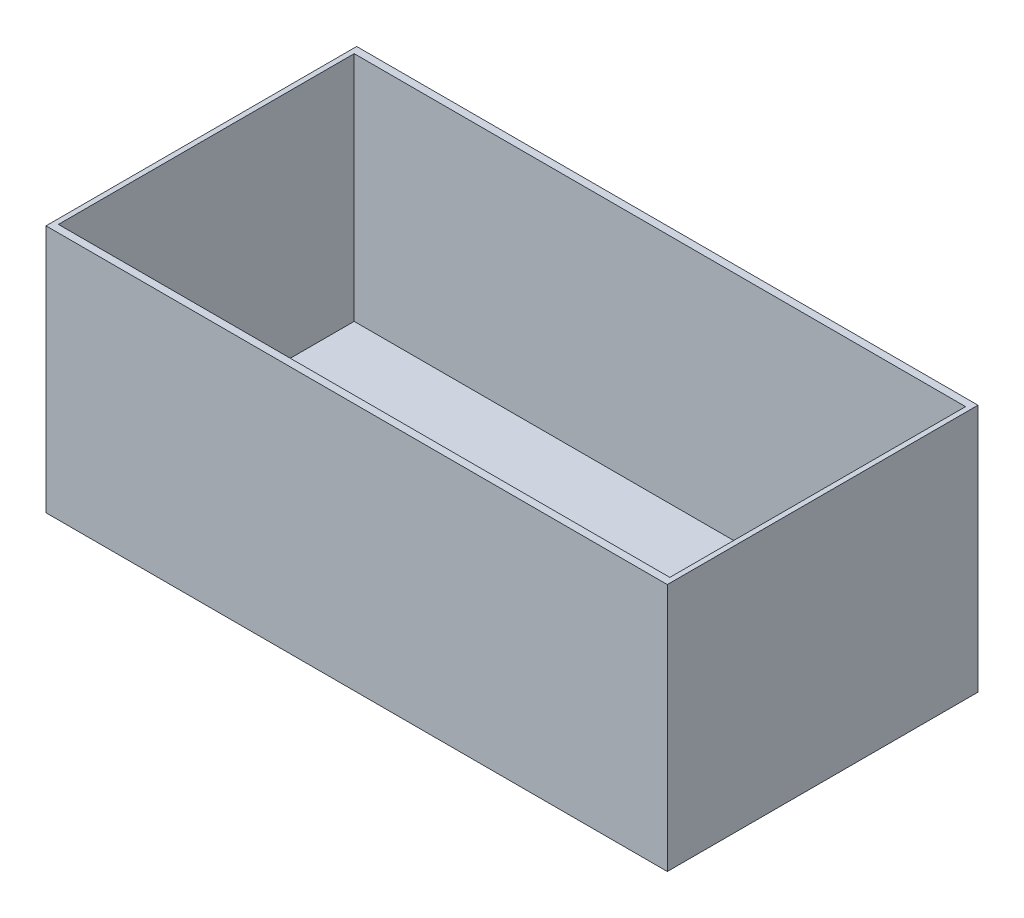
ISO-10303-21;
HEADER;
FILE_DESCRIPTION(('STEP AP214'),'2;1');
FILE_NAME('part.step','',(''),(''),'','','');
FILE_SCHEMA(('AUTOMOTIVE_DESIGN { 1 0 10303 214 1 1 1 1 }'));
ENDSEC;
DATA;
#1=APPLICATION_CONTEXT('core data for automotive mechanical design processes');
#2=APPLICATION_PROTOCOL_DEFINITION('international standard','automotive_design',2000,#1);
#3=PRODUCT_CONTEXT('',#1,'mechanical');
#4=PRODUCT('Part','Part','',(#3));
#5=PRODUCT_RELATED_PRODUCT_CATEGORY('part','',(#4));
#6=PRODUCT_DEFINITION_FORMATION('','',#4);
#7=PRODUCT_DEFINITION_CONTEXT('part definition',#1,'design');
#8=PRODUCT_DEFINITION('design','',#6,#7);
#9=PRODUCT_DEFINITION_SHAPE('','',#8);
#10=(LENGTH_UNIT() NAMED_UNIT(*) SI_UNIT(.MILLI.,.METRE.));
#11=(NAMED_UNIT(*) PLANE_ANGLE_UNIT() SI_UNIT($,.RADIAN.));
#12=(NAMED_UNIT(*) SI_UNIT($,.STERADIAN.) SOLID_ANGLE_UNIT());
#13=UNCERTAINTY_MEASURE_WITH_UNIT(LENGTH_MEASURE(1.E-05),#10,'distance_accuracy_value','');
#14=(GEOMETRIC_REPRESENTATION_CONTEXT(3) GLOBAL_UNCERTAINTY_ASSIGNED_CONTEXT((#13)) GLOBAL_UNIT_ASSIGNED_CONTEXT((#10,
#11,#12)) REPRESENTATION_CONTEXT('',''));
#15=CARTESIAN_POINT('',(0.,0.,0.));
#16=DIRECTION('',(0.,0.,1.));
#17=DIRECTION('',(1.,0.,0.));
#18=AXIS2_PLACEMENT_3D('',#15,#16,#17);
#19=CARTESIAN_POINT('',(-112.112112112112,1000.,-55.9309309309309));
#20=DIRECTION('',(1.,0.,0.));
#21=DIRECTION('',(0.,0.,-1.));
#22=AXIS2_PLACEMENT_3D('',#19,#20,#21);
#23=PLANE('',#22);
#24=DIRECTION('',(0.,0.,1.));
#25=VECTOR('',#24,1.);
#26=CARTESIAN_POINT('',(-112.112112112112,0.,-55.9309309309309));
#27=LINE('',#26,#25);
#28=CARTESIAN_POINT('',(-112.112112112112,0.,-55.9309309309309));
#29=VERTEX_POINT('',#28);
#30=CARTESIAN_POINT('',(-112.112112112112,0.,1194.06906906907));
#31=VERTEX_POINT('',#30);
#32=EDGE_CURVE('E140',#29,#31,#27,.T.);
#33=ORIENTED_EDGE('',*,*,#32,.T.);
#34=DIRECTION('',(0.,-1.,0.));
#35=VECTOR('',#34,1.);
#36=CARTESIAN_POINT('',(-112.112112112112,1000.,1194.06906906907));
#37=LINE('',#36,#35);
#38=CARTESIAN_POINT('',(-112.112112112112,1000.,1194.06906906907));
#39=VERTEX_POINT('',#38);
#40=EDGE_CURVE('E11',#39,#31,#37,.T.);
#41=ORIENTED_EDGE('',*,*,#40,.F.);
#42=DIRECTION('',(0.,0.,1.));
#43=VECTOR('',#42,1.);
#44=CARTESIAN_POINT('',(-112.112112112112,1000.,-55.9309309309309));
#45=LINE('',#44,#43);
#46=CARTESIAN_POINT('',(-112.112112112112,1000.,-55.9309309309309));
#47=VERTEX_POINT('',#46);
#48=EDGE_CURVE('E144',#47,#39,#45,.T.);
#49=ORIENTED_EDGE('',*,*,#48,.F.);
#50=DIRECTION('',(0.,-1.,0.));
#51=VECTOR('',#50,1.);
#52=CARTESIAN_POINT('',(-112.112112112112,1000.,-55.9309309309309));
#53=LINE('',#52,#51);
#54=EDGE_CURVE('E150',#47,#29,#53,.T.);
#55=ORIENTED_EDGE('',*,*,#54,.T.);
#56=EDGE_LOOP('',(#33,#41,#49,#55));
#57=FACE_BOUND('',#56,.T.);
#58=ADVANCED_FACE('F32',(#57),#23,.F.);
#59=CARTESIAN_POINT('',(-112.112112112112,1000.,1194.06906906907));
#60=DIRECTION('',(0.,0.,-1.));
#61=DIRECTION('',(-1.,0.,0.));
#62=AXIS2_PLACEMENT_3D('',#59,#60,#61);
#63=PLANE('',#62);
#64=DIRECTION('',(1.,0.,0.));
#65=VECTOR('',#64,1.);
#66=CARTESIAN_POINT('',(-112.112112112112,0.,1194.06906906907));
#67=LINE('',#66,#65);
#68=CARTESIAN_POINT('',(2387.88788788789,0.,1194.06906906907));
#69=VERTEX_POINT('',#68);
#70=EDGE_CURVE('E153',#31,#69,#67,.T.);
#71=ORIENTED_EDGE('',*,*,#70,.T.);
#72=DIRECTION('',(0.,-1.,0.));
#73=VECTOR('',#72,1.);
#74=CARTESIAN_POINT('',(2387.88788788789,1000.,1194.06906906907));
#75=LINE('',#74,#73);
#76=CARTESIAN_POINT('',(2387.88788788789,1000.,1194.06906906907));
#77=VERTEX_POINT('',#76);
#78=EDGE_CURVE('E39',#77,#69,#75,.T.);
#79=ORIENTED_EDGE('',*,*,#78,.F.);
#80=DIRECTION('',(1.,0.,0.));
#81=VECTOR('',#80,1.);
#82=CARTESIAN_POINT('',(-112.112112112112,1000.,1194.06906906907));
#83=LINE('',#82,#81);
#84=EDGE_CURVE('E83',#39,#77,#83,.T.);
#85=ORIENTED_EDGE('',*,*,#84,.F.);
#86=ORIENTED_EDGE('',*,*,#40,.T.);
#87=EDGE_LOOP('',(#71,#79,#85,#86));
#88=FACE_BOUND('',#87,.T.);
#89=ADVANCED_FACE('F182',(#88),#63,.F.);
#90=CARTESIAN_POINT('',(2387.88788788789,1000.,-55.9309309309309));
#91=DIRECTION('',(-1.,0.,0.));
#92=DIRECTION('',(0.,0.,1.));
#93=AXIS2_PLACEMENT_3D('',#90,#91,#92);
#94=PLANE('',#93);
#95=DIRECTION('',(0.,0.,-1.));
#96=VECTOR('',#95,1.);
#97=CARTESIAN_POINT('',(2387.88788788789,0.,-55.9309309309309));
#98=LINE('',#97,#96);
#99=CARTESIAN_POINT('',(2387.88788788789,0.,-55.9309309309309));
#100=VERTEX_POINT('',#99);
#101=EDGE_CURVE('E155',#69,#100,#98,.T.);
#102=ORIENTED_EDGE('',*,*,#101,.T.);
#103=DIRECTION('',(0.,-1.,0.));
#104=VECTOR('',#103,1.);
#105=CARTESIAN_POINT('',(2387.88788788789,1000.,-55.9309309309309));
#106=LINE('',#105,#104);
#107=CARTESIAN_POINT('',(2387.88788788789,1000.,-55.9309309309309));
#108=VERTEX_POINT('',#107);
#109=EDGE_CURVE('E159',#108,#100,#106,.T.);
#110=ORIENTED_EDGE('',*,*,#109,.F.);
#111=DIRECTION('',(0.,0.,-1.));
#112=VECTOR('',#111,1.);
#113=CARTESIAN_POINT('',(2387.88788788789,1000.,-55.9309309309309));
#114=LINE('',#113,#112);
#115=EDGE_CURVE('E147',#77,#108,#114,.T.);
#116=ORIENTED_EDGE('',*,*,#115,.F.);
#117=ORIENTED_EDGE('',*,*,#78,.T.);
#118=EDGE_LOOP('',(#102,#110,#116,#117));
#119=FACE_BOUND('',#118,.T.);
#120=ADVANCED_FACE('F164',(#119),#94,.F.);
#121=CARTESIAN_POINT('',(-112.112112112112,1000.,-55.9309309309309));
#122=DIRECTION('',(0.,0.,1.));
#123=DIRECTION('',(1.,0.,0.));
#124=AXIS2_PLACEMENT_3D('',#121,#122,#123);
#125=PLANE('',#124);
#126=DIRECTION('',(-1.,0.,0.));
#127=VECTOR('',#126,1.);
#128=CARTESIAN_POINT('',(-112.112112112112,0.,-55.9309309309309));
#129=LINE('',#128,#127);
#130=EDGE_CURVE('E76',#100,#29,#129,.T.);
#131=ORIENTED_EDGE('',*,*,#130,.T.);
#132=ORIENTED_EDGE('',*,*,#54,.F.);
#133=DIRECTION('',(-1.,0.,0.));
#134=VECTOR('',#133,1.);
#135=CARTESIAN_POINT('',(-112.112112112112,1000.,-55.9309309309309));
#136=LINE('',#135,#134);
#137=EDGE_CURVE('E55',#108,#47,#136,.T.);
#138=ORIENTED_EDGE('',*,*,#137,.F.);
#139=ORIENTED_EDGE('',*,*,#109,.T.);
#140=EDGE_LOOP('',(#131,#132,#138,#139));
#141=FACE_BOUND('',#140,.T.);
#142=ADVANCED_FACE('F172',(#141),#125,.F.);
#143=CARTESIAN_POINT('',(0.,1000.,0.));
#144=DIRECTION('',(0.,1.,0.));
#145=DIRECTION('',(0.,0.,1.));
#146=AXIS2_PLACEMENT_3D('',#143,#144,#145);
#147=PLANE('',#146);
#148=DIRECTION('',(0.,0.,1.));
#149=VECTOR('',#148,1.);
#150=CARTESIAN_POINT('',(-92.1121121121121,1000.,-25.9309309309309));
#151=LINE('',#150,#149);
#152=CARTESIAN_POINT('',(-92.1121121121121,1000.,-25.9309309309309));
#153=VERTEX_POINT('',#152);
#154=CARTESIAN_POINT('',(-92.112112112112,1000.,1164.06906906907));
#155=VERTEX_POINT('',#154);
#156=EDGE_CURVE('E46',#153,#155,#151,.T.);
#157=ORIENTED_EDGE('',*,*,#156,.F.);
#158=DIRECTION('',(-1.,0.,0.));
#159=VECTOR('',#158,1.);
#160=CARTESIAN_POINT('',(-92.1121121121121,1000.,-25.9309309309309));
#161=LINE('',#160,#159);
#162=CARTESIAN_POINT('',(2367.88788788789,1000.,-25.9309309309309));
#163=VERTEX_POINT('',#162);
#164=EDGE_CURVE('E125',#163,#153,#161,.T.);
#165=ORIENTED_EDGE('',*,*,#164,.F.);
#166=DIRECTION('',(0.,0.,-1.));
#167=VECTOR('',#166,1.);
#168=CARTESIAN_POINT('',(2367.88788788789,1000.,-25.9309309309309));
#169=LINE('',#168,#167);
#170=CARTESIAN_POINT('',(2367.88788788789,1000.,1164.06906906907));
#171=VERTEX_POINT('',#170);
#172=EDGE_CURVE('E128',#171,#163,#169,.T.);
#173=ORIENTED_EDGE('',*,*,#172,.F.);
#174=DIRECTION('',(1.,0.,0.));
#175=VECTOR('',#174,1.);
#176=CARTESIAN_POINT('',(-92.112112112112,1000.,1164.06906906907));
#177=LINE('',#176,#175);
#178=EDGE_CURVE('E134',#155,#171,#177,.T.);
#179=ORIENTED_EDGE('',*,*,#178,.F.);
#180=EDGE_LOOP('',(#157,#165,#173,#179));
#181=FACE_BOUND('',#180,.T.);
#182=ORIENTED_EDGE('',*,*,#48,.T.);
#183=ORIENTED_EDGE('',*,*,#84,.T.);
#184=ORIENTED_EDGE('',*,*,#115,.T.);
#185=ORIENTED_EDGE('',*,*,#137,.T.);
#186=EDGE_LOOP('',(#182,#183,#184,#185));
#187=FACE_BOUND('',#186,.T.);
#188=ADVANCED_FACE('F174',(#181,#187),#147,.T.);
#189=CARTESIAN_POINT('',(0.,0.,0.));
#190=DIRECTION('',(0.,1.,0.));
#191=DIRECTION('',(0.,0.,1.));
#192=AXIS2_PLACEMENT_3D('',#189,#190,#191);
#193=PLANE('',#192);
#194=ORIENTED_EDGE('',*,*,#32,.F.);
#195=ORIENTED_EDGE('',*,*,#130,.F.);
#196=ORIENTED_EDGE('',*,*,#101,.F.);
#197=ORIENTED_EDGE('',*,*,#70,.F.);
#198=EDGE_LOOP('',(#194,#195,#196,#197));
#199=FACE_BOUND('',#198,.T.);
#200=ADVANCED_FACE('F168',(#199),#193,.F.);
#201=CARTESIAN_POINT('',(-92.1121121121121,66.9999999999988,-25.9309309309309));
#202=DIRECTION('',(-1.,0.,0.));
#203=DIRECTION('',(0.,0.,1.));
#204=AXIS2_PLACEMENT_3D('',#201,#202,#203);
#205=PLANE('',#204);
#206=ORIENTED_EDGE('',*,*,#156,.T.);
#207=DIRECTION('',(0.,1.,0.));
#208=VECTOR('',#207,1.);
#209=CARTESIAN_POINT('',(-92.112112112112,66.9999999999988,1164.06906906907));
#210=LINE('',#209,#208);
#211=CARTESIAN_POINT('',(-92.112112112112,66.9999999999988,1164.06906906907));
#212=VERTEX_POINT('',#211);
#213=EDGE_CURVE('E103',#212,#155,#210,.T.);
#214=ORIENTED_EDGE('',*,*,#213,.F.);
#215=DIRECTION('',(0.,0.,1.));
#216=VECTOR('',#215,1.);
#217=CARTESIAN_POINT('',(-92.1121121121121,66.9999999999988,-25.9309309309309));
#218=LINE('',#217,#216);
#219=CARTESIAN_POINT('',(-92.1121121121121,66.9999999999988,-25.9309309309309));
#220=VERTEX_POINT('',#219);
#221=EDGE_CURVE('E107',#220,#212,#218,.T.);
#222=ORIENTED_EDGE('',*,*,#221,.F.);
#223=DIRECTION('',(0.,1.,0.));
#224=VECTOR('',#223,1.);
#225=CARTESIAN_POINT('',(-92.1121121121121,66.9999999999988,-25.9309309309309));
#226=LINE('',#225,#224);
#227=EDGE_CURVE('E138',#220,#153,#226,.T.);
#228=ORIENTED_EDGE('',*,*,#227,.T.);
#229=EDGE_LOOP('',(#206,#214,#222,#228));
#230=FACE_BOUND('',#229,.T.);
#231=ADVANCED_FACE('F105',(#230),#205,.F.);
#232=CARTESIAN_POINT('',(-92.1121121121121,66.9999999999988,-25.9309309309309));
#233=DIRECTION('',(0.,0.,-1.));
#234=DIRECTION('',(-1.,0.,0.));
#235=AXIS2_PLACEMENT_3D('',#232,#233,#234);
#236=PLANE('',#235);
#237=ORIENTED_EDGE('',*,*,#164,.T.);
#238=ORIENTED_EDGE('',*,*,#227,.F.);
#239=DIRECTION('',(-1.,0.,0.));
#240=VECTOR('',#239,1.);
#241=CARTESIAN_POINT('',(-92.1121121121121,66.9999999999988,-25.9309309309309));
#242=LINE('',#241,#240);
#243=CARTESIAN_POINT('',(2367.88788788789,66.9999999999988,-25.9309309309309));
#244=VERTEX_POINT('',#243);
#245=EDGE_CURVE('E113',#244,#220,#242,.T.);
#246=ORIENTED_EDGE('',*,*,#245,.F.);
#247=DIRECTION('',(0.,1.,0.));
#248=VECTOR('',#247,1.);
#249=CARTESIAN_POINT('',(2367.88788788789,66.9999999999988,-25.9309309309309));
#250=LINE('',#249,#248);
#251=EDGE_CURVE('E141',#244,#163,#250,.T.);
#252=ORIENTED_EDGE('',*,*,#251,.T.);
#253=EDGE_LOOP('',(#237,#238,#246,#252));
#254=FACE_BOUND('',#253,.T.);
#255=ADVANCED_FACE('F221',(#254),#236,.F.);
#256=CARTESIAN_POINT('',(2367.88788788789,66.9999999999988,-25.9309309309309));
#257=DIRECTION('',(1.,0.,0.));
#258=DIRECTION('',(0.,0.,-1.));
#259=AXIS2_PLACEMENT_3D('',#256,#257,#258);
#260=PLANE('',#259);
#261=ORIENTED_EDGE('',*,*,#172,.T.);
#262=ORIENTED_EDGE('',*,*,#251,.F.);
#263=DIRECTION('',(0.,0.,-1.));
#264=VECTOR('',#263,1.);
#265=CARTESIAN_POINT('',(2367.88788788789,66.9999999999988,-25.9309309309309));
#266=LINE('',#265,#264);
#267=CARTESIAN_POINT('',(2367.88788788789,66.9999999999988,1164.06906906907));
#268=VERTEX_POINT('',#267);
#269=EDGE_CURVE('E121',#268,#244,#266,.T.);
#270=ORIENTED_EDGE('',*,*,#269,.F.);
#271=DIRECTION('',(0.,1.,0.));
#272=VECTOR('',#271,1.);
#273=CARTESIAN_POINT('',(2367.88788788789,66.9999999999988,1164.06906906907));
#274=LINE('',#273,#272);
#275=EDGE_CURVE('E112',#268,#171,#274,.T.);
#276=ORIENTED_EDGE('',*,*,#275,.T.);
#277=EDGE_LOOP('',(#261,#262,#270,#276));
#278=FACE_BOUND('',#277,.T.);
#279=ADVANCED_FACE('F230',(#278),#260,.F.);
#280=CARTESIAN_POINT('',(-92.112112112112,66.9999999999988,1164.06906906907));
#281=DIRECTION('',(0.,0.,1.));
#282=DIRECTION('',(1.,0.,0.));
#283=AXIS2_PLACEMENT_3D('',#280,#281,#282);
#284=PLANE('',#283);
#285=ORIENTED_EDGE('',*,*,#178,.T.);
#286=ORIENTED_EDGE('',*,*,#275,.F.);
#287=DIRECTION('',(1.,0.,0.));
#288=VECTOR('',#287,1.);
#289=CARTESIAN_POINT('',(-92.112112112112,66.9999999999988,1164.06906906907));
#290=LINE('',#289,#288);
#291=EDGE_CURVE('E116',#212,#268,#290,.T.);
#292=ORIENTED_EDGE('',*,*,#291,.F.);
#293=ORIENTED_EDGE('',*,*,#213,.T.);
#294=EDGE_LOOP('',(#285,#286,#292,#293));
#295=FACE_BOUND('',#294,.T.);
#296=ADVANCED_FACE('F117',(#295),#284,.F.);
#297=CARTESIAN_POINT('',(0.,66.9999999999988,0.));
#298=DIRECTION('',(0.,1.,0.));
#299=DIRECTION('',(0.,0.,1.));
#300=AXIS2_PLACEMENT_3D('',#297,#298,#299);
#301=PLANE('',#300);
#302=ORIENTED_EDGE('',*,*,#221,.T.);
#303=ORIENTED_EDGE('',*,*,#291,.T.);
#304=ORIENTED_EDGE('',*,*,#269,.T.);
#305=ORIENTED_EDGE('',*,*,#245,.T.);
#306=EDGE_LOOP('',(#302,#303,#304,#305));
#307=FACE_BOUND('',#306,.T.);
#308=ADVANCED_FACE('F123',(#307),#301,.T.);
#309=CLOSED_SHELL('',(#58,#89,#120,#142,#188,#200,#231,#255,#279,#296,#308));
#310=MANIFOLD_SOLID_BREP('B2',#309);
#311=ADVANCED_BREP_SHAPE_REPRESENTATION('',(#18,#310),#14);
#312=SHAPE_DEFINITION_REPRESENTATION(#9,#311);
ENDSEC;
END-ISO-10303-21;
